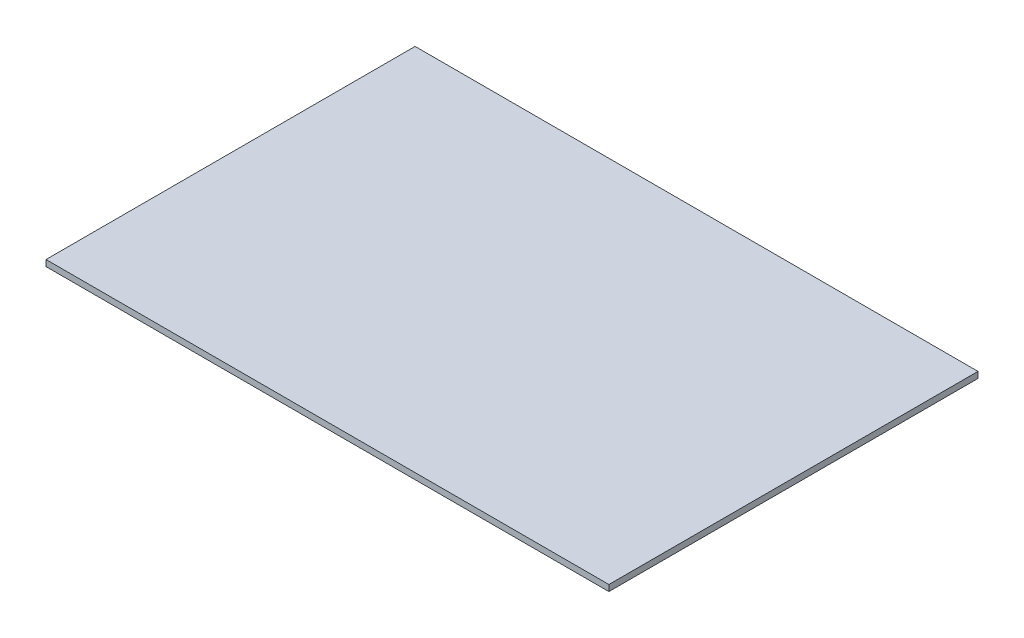
ISO-10303-21;
HEADER;
FILE_DESCRIPTION(('STEP AP214'),'2;1');
FILE_NAME('part.step','',(''),(''),'','','');
FILE_SCHEMA(('AUTOMOTIVE_DESIGN { 1 0 10303 214 1 1 1 1 }'));
ENDSEC;
DATA;
#1=APPLICATION_CONTEXT('core data for automotive mechanical design processes');
#2=APPLICATION_PROTOCOL_DEFINITION('international standard','automotive_design',2000,#1);
#3=PRODUCT_CONTEXT('',#1,'mechanical');
#4=PRODUCT('Part','Part','',(#3));
#5=PRODUCT_RELATED_PRODUCT_CATEGORY('part','',(#4));
#6=PRODUCT_DEFINITION_FORMATION('','',#4);
#7=PRODUCT_DEFINITION_CONTEXT('part definition',#1,'design');
#8=PRODUCT_DEFINITION('design','',#6,#7);
#9=PRODUCT_DEFINITION_SHAPE('','',#8);
#10=(LENGTH_UNIT() NAMED_UNIT(*) SI_UNIT(.MILLI.,.METRE.));
#11=(NAMED_UNIT(*) PLANE_ANGLE_UNIT() SI_UNIT($,.RADIAN.));
#12=(NAMED_UNIT(*) SI_UNIT($,.STERADIAN.) SOLID_ANGLE_UNIT());
#13=UNCERTAINTY_MEASURE_WITH_UNIT(LENGTH_MEASURE(1.E-05),#10,'distance_accuracy_value','');
#14=(GEOMETRIC_REPRESENTATION_CONTEXT(3) GLOBAL_UNCERTAINTY_ASSIGNED_CONTEXT((#13)) GLOBAL_UNIT_ASSIGNED_CONTEXT((#10,
#11,#12)) REPRESENTATION_CONTEXT('',''));
#15=CARTESIAN_POINT('',(0.,0.,0.));
#16=DIRECTION('',(0.,0.,1.));
#17=DIRECTION('',(1.,0.,0.));
#18=AXIS2_PLACEMENT_3D('',#15,#16,#17);
#19=CARTESIAN_POINT('',(0.,10.,0.));
#20=DIRECTION('',(-1.,0.,0.));
#21=DIRECTION('',(0.,0.,1.));
#22=AXIS2_PLACEMENT_3D('',#19,#20,#21);
#23=PLANE('',#22);
#24=DIRECTION('',(0.,0.,-1.));
#25=VECTOR('',#24,1.);
#26=CARTESIAN_POINT('',(0.,0.,0.));
#27=LINE('',#26,#25);
#28=CARTESIAN_POINT('',(0.,0.,599.6));
#29=VERTEX_POINT('',#28);
#30=CARTESIAN_POINT('',(0.,0.,0.));
#31=VERTEX_POINT('',#30);
#32=EDGE_CURVE('E107',#29,#31,#27,.T.);
#33=ORIENTED_EDGE('',*,*,#32,.T.);
#34=DIRECTION('',(0.,-1.,0.));
#35=VECTOR('',#34,1.);
#36=CARTESIAN_POINT('',(0.,10.,0.));
#37=LINE('',#36,#35);
#38=CARTESIAN_POINT('',(0.,10.,0.));
#39=VERTEX_POINT('',#38);
#40=EDGE_CURVE('E11',#39,#31,#37,.T.);
#41=ORIENTED_EDGE('',*,*,#40,.F.);
#42=DIRECTION('',(0.,0.,-1.));
#43=VECTOR('',#42,1.);
#44=CARTESIAN_POINT('',(0.,10.,0.));
#45=LINE('',#44,#43);
#46=CARTESIAN_POINT('',(0.,10.,599.6));
#47=VERTEX_POINT('',#46);
#48=EDGE_CURVE('E91',#47,#39,#45,.T.);
#49=ORIENTED_EDGE('',*,*,#48,.F.);
#50=DIRECTION('',(0.,-1.,0.));
#51=VECTOR('',#50,1.);
#52=CARTESIAN_POINT('',(0.,10.,599.6));
#53=LINE('',#52,#51);
#54=EDGE_CURVE('E103',#47,#29,#53,.T.);
#55=ORIENTED_EDGE('',*,*,#54,.T.);
#56=EDGE_LOOP('',(#33,#41,#49,#55));
#57=FACE_BOUND('',#56,.T.);
#58=ADVANCED_FACE('F39',(#57),#23,.F.);
#59=CARTESIAN_POINT('',(0.,10.,0.));
#60=DIRECTION('',(0.,0.,1.));
#61=DIRECTION('',(1.,0.,0.));
#62=AXIS2_PLACEMENT_3D('',#59,#60,#61);
#63=PLANE('',#62);
#64=DIRECTION('',(-1.,0.,0.));
#65=VECTOR('',#64,1.);
#66=CARTESIAN_POINT('',(0.,0.,0.));
#67=LINE('',#66,#65);
#68=CARTESIAN_POINT('',(-914.4,0.,1.11981703314034E-13));
#69=VERTEX_POINT('',#68);
#70=EDGE_CURVE('E96',#31,#69,#67,.T.);
#71=ORIENTED_EDGE('',*,*,#70,.T.);
#72=DIRECTION('',(0.,-1.,0.));
#73=VECTOR('',#72,1.);
#74=CARTESIAN_POINT('',(-914.4,10.,1.11981703314034E-13));
#75=LINE('',#74,#73);
#76=CARTESIAN_POINT('',(-914.4,10.,1.11981703314034E-13));
#77=VERTEX_POINT('',#76);
#78=EDGE_CURVE('E48',#77,#69,#75,.T.);
#79=ORIENTED_EDGE('',*,*,#78,.F.);
#80=DIRECTION('',(-1.,0.,0.));
#81=VECTOR('',#80,1.);
#82=CARTESIAN_POINT('',(0.,10.,0.));
#83=LINE('',#82,#81);
#84=EDGE_CURVE('E86',#39,#77,#83,.T.);
#85=ORIENTED_EDGE('',*,*,#84,.F.);
#86=ORIENTED_EDGE('',*,*,#40,.T.);
#87=EDGE_LOOP('',(#71,#79,#85,#86));
#88=FACE_BOUND('',#87,.T.);
#89=ADVANCED_FACE('F95',(#88),#63,.F.);
#90=CARTESIAN_POINT('',(-914.4,10.,1.11981703314034E-13));
#91=DIRECTION('',(1.,0.,0.));
#92=DIRECTION('',(0.,0.,-1.));
#93=AXIS2_PLACEMENT_3D('',#90,#91,#92);
#94=PLANE('',#93);
#95=DIRECTION('',(0.,0.,1.));
#96=VECTOR('',#95,1.);
#97=CARTESIAN_POINT('',(-914.4,0.,1.11981703314034E-13));
#98=LINE('',#97,#96);
#99=CARTESIAN_POINT('',(-914.4,0.,599.6));
#100=VERTEX_POINT('',#99);
#101=EDGE_CURVE('E73',#69,#100,#98,.T.);
#102=ORIENTED_EDGE('',*,*,#101,.T.);
#103=DIRECTION('',(0.,-1.,0.));
#104=VECTOR('',#103,1.);
#105=CARTESIAN_POINT('',(-914.4,10.,599.6));
#106=LINE('',#105,#104);
#107=CARTESIAN_POINT('',(-914.4,10.,599.6));
#108=VERTEX_POINT('',#107);
#109=EDGE_CURVE('E98',#108,#100,#106,.T.);
#110=ORIENTED_EDGE('',*,*,#109,.F.);
#111=DIRECTION('',(0.,0.,1.));
#112=VECTOR('',#111,1.);
#113=CARTESIAN_POINT('',(-914.4,10.,1.11981703314034E-13));
#114=LINE('',#113,#112);
#115=EDGE_CURVE('E89',#77,#108,#114,.T.);
#116=ORIENTED_EDGE('',*,*,#115,.F.);
#117=ORIENTED_EDGE('',*,*,#78,.T.);
#118=EDGE_LOOP('',(#102,#110,#116,#117));
#119=FACE_BOUND('',#118,.T.);
#120=ADVANCED_FACE('F99',(#119),#94,.F.);
#121=CARTESIAN_POINT('',(0.,10.,599.6));
#122=DIRECTION('',(0.,0.,-1.));
#123=DIRECTION('',(-1.,0.,0.));
#124=AXIS2_PLACEMENT_3D('',#121,#122,#123);
#125=PLANE('',#124);
#126=DIRECTION('',(1.,0.,0.));
#127=VECTOR('',#126,1.);
#128=CARTESIAN_POINT('',(0.,0.,599.6));
#129=LINE('',#128,#127);
#130=EDGE_CURVE('E79',#100,#29,#129,.T.);
#131=ORIENTED_EDGE('',*,*,#130,.T.);
#132=ORIENTED_EDGE('',*,*,#54,.F.);
#133=DIRECTION('',(1.,0.,0.));
#134=VECTOR('',#133,1.);
#135=CARTESIAN_POINT('',(0.,10.,599.6));
#136=LINE('',#135,#134);
#137=EDGE_CURVE('E56',#108,#47,#136,.T.);
#138=ORIENTED_EDGE('',*,*,#137,.F.);
#139=ORIENTED_EDGE('',*,*,#109,.T.);
#140=EDGE_LOOP('',(#131,#132,#138,#139));
#141=FACE_BOUND('',#140,.T.);
#142=ADVANCED_FACE('F120',(#141),#125,.F.);
#143=CARTESIAN_POINT('',(0.,10.,0.));
#144=DIRECTION('',(0.,-1.,0.));
#145=DIRECTION('',(0.,0.,-1.));
#146=AXIS2_PLACEMENT_3D('',#143,#144,#145);
#147=PLANE('',#146);
#148=ORIENTED_EDGE('',*,*,#48,.T.);
#149=ORIENTED_EDGE('',*,*,#84,.T.);
#150=ORIENTED_EDGE('',*,*,#115,.T.);
#151=ORIENTED_EDGE('',*,*,#137,.T.);
#152=EDGE_LOOP('',(#148,#149,#150,#151));
#153=FACE_BOUND('',#152,.T.);
#154=ADVANCED_FACE('F87',(#153),#147,.F.);
#155=CARTESIAN_POINT('',(0.,0.,0.));
#156=DIRECTION('',(0.,-1.,0.));
#157=DIRECTION('',(0.,0.,-1.));
#158=AXIS2_PLACEMENT_3D('',#155,#156,#157);
#159=PLANE('',#158);
#160=ORIENTED_EDGE('',*,*,#32,.F.);
#161=ORIENTED_EDGE('',*,*,#130,.F.);
#162=ORIENTED_EDGE('',*,*,#101,.F.);
#163=ORIENTED_EDGE('',*,*,#70,.F.);
#164=EDGE_LOOP('',(#160,#161,#162,#163));
#165=FACE_BOUND('',#164,.T.);
#166=ADVANCED_FACE('F123',(#165),#159,.T.);
#167=CLOSED_SHELL('',(#58,#89,#120,#142,#154,#166));
#168=MANIFOLD_SOLID_BREP('B2',#167);
#169=ADVANCED_BREP_SHAPE_REPRESENTATION('',(#18,#168),#14);
#170=SHAPE_DEFINITION_REPRESENTATION(#9,#169);
ENDSEC;
END-ISO-10303-21;
